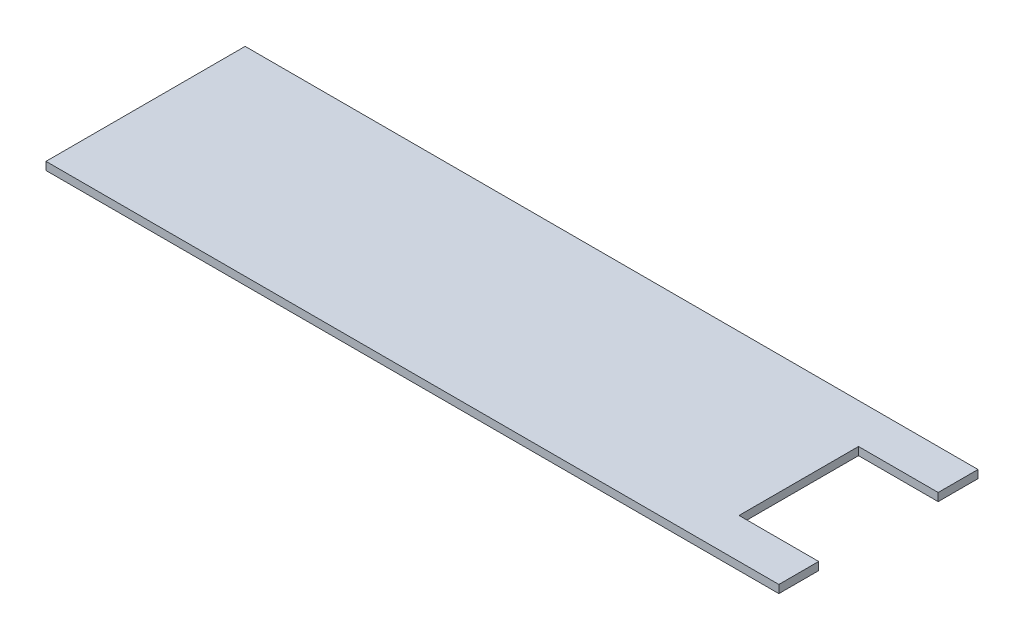
ISO-10303-21;
HEADER;
FILE_DESCRIPTION(('STEP AP214'),'2;1');
FILE_NAME('part.step','',(''),(''),'','','');
FILE_SCHEMA(('AUTOMOTIVE_DESIGN { 1 0 10303 214 1 1 1 1 }'));
ENDSEC;
DATA;
#1=APPLICATION_CONTEXT('core data for automotive mechanical design processes');
#2=APPLICATION_PROTOCOL_DEFINITION('international standard','automotive_design',2000,#1);
#3=PRODUCT_CONTEXT('',#1,'mechanical');
#4=PRODUCT('Part','Part','',(#3));
#5=PRODUCT_RELATED_PRODUCT_CATEGORY('part','',(#4));
#6=PRODUCT_DEFINITION_FORMATION('','',#4);
#7=PRODUCT_DEFINITION_CONTEXT('part definition',#1,'design');
#8=PRODUCT_DEFINITION('design','',#6,#7);
#9=PRODUCT_DEFINITION_SHAPE('','',#8);
#10=(LENGTH_UNIT() NAMED_UNIT(*) SI_UNIT(.MILLI.,.METRE.));
#11=(NAMED_UNIT(*) PLANE_ANGLE_UNIT() SI_UNIT($,.RADIAN.));
#12=(NAMED_UNIT(*) SI_UNIT($,.STERADIAN.) SOLID_ANGLE_UNIT());
#13=UNCERTAINTY_MEASURE_WITH_UNIT(LENGTH_MEASURE(1.E-05),#10,'distance_accuracy_value','');
#14=(GEOMETRIC_REPRESENTATION_CONTEXT(3) GLOBAL_UNCERTAINTY_ASSIGNED_CONTEXT((#13)) GLOBAL_UNIT_ASSIGNED_CONTEXT((#10,
#11,#12)) REPRESENTATION_CONTEXT('',''));
#15=CARTESIAN_POINT('',(0.,0.,0.));
#16=DIRECTION('',(0.,0.,1.));
#17=DIRECTION('',(1.,0.,0.));
#18=AXIS2_PLACEMENT_3D('',#15,#16,#17);
#19=CARTESIAN_POINT('',(37.5961538461538,1.,-14.1346153846153));
#20=DIRECTION('',(-1.,0.,0.));
#21=DIRECTION('',(0.,0.,1.));
#22=AXIS2_PLACEMENT_3D('',#19,#20,#21);
#23=PLANE('',#22);
#24=DIRECTION('',(0.,0.,-1.));
#25=VECTOR('',#24,1.);
#26=CARTESIAN_POINT('',(37.5961538461538,1.,-14.1346153846153));
#27=LINE('',#26,#25);
#28=CARTESIAN_POINT('',(37.5961538461538,1.,-9.13461538461535));
#29=VERTEX_POINT('',#28);
#30=CARTESIAN_POINT('',(37.5961538461538,1.,-14.1346153846153));
#31=VERTEX_POINT('',#30);
#32=EDGE_CURVE('E165',#29,#31,#27,.T.);
#33=ORIENTED_EDGE('',*,*,#32,.F.);
#34=DIRECTION('',(0.,1.,0.));
#35=VECTOR('',#34,1.);
#36=CARTESIAN_POINT('',(37.5961538461538,0.,-9.13461538461535));
#37=LINE('',#36,#35);
#38=CARTESIAN_POINT('',(37.5961538461538,0.,-9.13461538461535));
#39=VERTEX_POINT('',#38);
#40=EDGE_CURVE('E155',#39,#29,#37,.T.);
#41=ORIENTED_EDGE('',*,*,#40,.F.);
#42=DIRECTION('',(0.,0.,-1.));
#43=VECTOR('',#42,1.);
#44=CARTESIAN_POINT('',(37.5961538461538,0.,-14.1346153846153));
#45=LINE('',#44,#43);
#46=CARTESIAN_POINT('',(37.5961538461538,0.,-14.1346153846153));
#47=VERTEX_POINT('',#46);
#48=EDGE_CURVE('E179',#39,#47,#45,.T.);
#49=ORIENTED_EDGE('',*,*,#48,.T.);
#50=DIRECTION('',(0.,-1.,0.));
#51=VECTOR('',#50,1.);
#52=CARTESIAN_POINT('',(37.5961538461538,1.,-14.1346153846153));
#53=LINE('',#52,#51);
#54=EDGE_CURVE('E187',#31,#47,#53,.T.);
#55=ORIENTED_EDGE('',*,*,#54,.F.);
#56=EDGE_LOOP('',(#33,#41,#49,#55));
#57=FACE_BOUND('',#56,.T.);
#58=ADVANCED_FACE('F41',(#57),#23,.F.);
#59=CARTESIAN_POINT('',(-54.4038461538462,1.,-14.1346153846153));
#60=DIRECTION('',(1.,0.,0.));
#61=DIRECTION('',(0.,0.,-1.));
#62=AXIS2_PLACEMENT_3D('',#59,#60,#61);
#63=PLANE('',#62);
#64=DIRECTION('',(0.,0.,1.));
#65=VECTOR('',#64,1.);
#66=CARTESIAN_POINT('',(-54.4038461538462,0.,-14.1346153846153));
#67=LINE('',#66,#65);
#68=CARTESIAN_POINT('',(-54.4038461538462,0.,-14.1346153846153));
#69=VERTEX_POINT('',#68);
#70=CARTESIAN_POINT('',(-54.4038461538462,0.,10.8653846153847));
#71=VERTEX_POINT('',#70);
#72=EDGE_CURVE('E154',#69,#71,#67,.T.);
#73=ORIENTED_EDGE('',*,*,#72,.T.);
#74=DIRECTION('',(0.,-1.,0.));
#75=VECTOR('',#74,1.);
#76=CARTESIAN_POINT('',(-54.4038461538462,1.,10.8653846153847));
#77=LINE('',#76,#75);
#78=CARTESIAN_POINT('',(-54.4038461538462,1.,10.8653846153847));
#79=VERTEX_POINT('',#78);
#80=EDGE_CURVE('E11',#79,#71,#77,.T.);
#81=ORIENTED_EDGE('',*,*,#80,.F.);
#82=DIRECTION('',(0.,0.,1.));
#83=VECTOR('',#82,1.);
#84=CARTESIAN_POINT('',(-54.4038461538462,1.,-14.1346153846153));
#85=LINE('',#84,#83);
#86=CARTESIAN_POINT('',(-54.4038461538462,1.,-14.1346153846153));
#87=VERTEX_POINT('',#86);
#88=EDGE_CURVE('E160',#87,#79,#85,.T.);
#89=ORIENTED_EDGE('',*,*,#88,.F.);
#90=DIRECTION('',(0.,-1.,0.));
#91=VECTOR('',#90,1.);
#92=CARTESIAN_POINT('',(-54.4038461538462,1.,-14.1346153846153));
#93=LINE('',#92,#91);
#94=EDGE_CURVE('E172',#87,#69,#93,.T.);
#95=ORIENTED_EDGE('',*,*,#94,.T.);
#96=EDGE_LOOP('',(#73,#81,#89,#95));
#97=FACE_BOUND('',#96,.T.);
#98=ADVANCED_FACE('F43',(#97),#63,.F.);
#99=CARTESIAN_POINT('',(-54.4038461538462,1.,10.8653846153847));
#100=DIRECTION('',(0.,0.,-1.));
#101=DIRECTION('',(-1.,0.,0.));
#102=AXIS2_PLACEMENT_3D('',#99,#100,#101);
#103=PLANE('',#102);
#104=DIRECTION('',(1.,0.,0.));
#105=VECTOR('',#104,1.);
#106=CARTESIAN_POINT('',(-54.4038461538462,0.,10.8653846153847));
#107=LINE('',#106,#105);
#108=CARTESIAN_POINT('',(37.5961538461538,0.,10.8653846153847));
#109=VERTEX_POINT('',#108);
#110=EDGE_CURVE('E176',#71,#109,#107,.T.);
#111=ORIENTED_EDGE('',*,*,#110,.T.);
#112=DIRECTION('',(0.,-1.,0.));
#113=VECTOR('',#112,1.);
#114=CARTESIAN_POINT('',(37.5961538461538,1.,10.8653846153847));
#115=LINE('',#114,#113);
#116=CARTESIAN_POINT('',(37.5961538461538,1.,10.8653846153847));
#117=VERTEX_POINT('',#116);
#118=EDGE_CURVE('E50',#117,#109,#115,.T.);
#119=ORIENTED_EDGE('',*,*,#118,.F.);
#120=DIRECTION('',(1.,0.,0.));
#121=VECTOR('',#120,1.);
#122=CARTESIAN_POINT('',(-54.4038461538462,1.,10.8653846153847));
#123=LINE('',#122,#121);
#124=EDGE_CURVE('E94',#79,#117,#123,.T.);
#125=ORIENTED_EDGE('',*,*,#124,.F.);
#126=ORIENTED_EDGE('',*,*,#80,.T.);
#127=EDGE_LOOP('',(#111,#119,#125,#126));
#128=FACE_BOUND('',#127,.T.);
#129=ADVANCED_FACE('F196',(#128),#103,.F.);
#130=CARTESIAN_POINT('',(37.5961538461538,0.,5.86538461538465));
#131=VERTEX_POINT('',#130);
#132=EDGE_CURVE('E180',#109,#131,#45,.T.);
#133=ORIENTED_EDGE('',*,*,#132,.T.);
#134=DIRECTION('',(0.,1.,0.));
#135=VECTOR('',#134,1.);
#136=CARTESIAN_POINT('',(37.5961538461538,0.,5.86538461538465));
#137=LINE('',#136,#135);
#138=CARTESIAN_POINT('',(37.5961538461538,1.,5.86538461538465));
#139=VERTEX_POINT('',#138);
#140=EDGE_CURVE('E57',#131,#139,#137,.T.);
#141=ORIENTED_EDGE('',*,*,#140,.T.);
#142=EDGE_CURVE('E166',#117,#139,#27,.T.);
#143=ORIENTED_EDGE('',*,*,#142,.F.);
#144=ORIENTED_EDGE('',*,*,#118,.T.);
#145=EDGE_LOOP('',(#133,#141,#143,#144));
#146=FACE_BOUND('',#145,.T.);
#147=ADVANCED_FACE('F193',(#146),#23,.F.);
#148=CARTESIAN_POINT('',(-54.4038461538462,1.,-14.1346153846153));
#149=DIRECTION('',(0.,0.,1.));
#150=DIRECTION('',(1.,0.,0.));
#151=AXIS2_PLACEMENT_3D('',#148,#149,#150);
#152=PLANE('',#151);
#153=DIRECTION('',(-1.,0.,0.));
#154=VECTOR('',#153,1.);
#155=CARTESIAN_POINT('',(-54.4038461538462,0.,-14.1346153846153));
#156=LINE('',#155,#154);
#157=EDGE_CURVE('E87',#47,#69,#156,.T.);
#158=ORIENTED_EDGE('',*,*,#157,.T.);
#159=ORIENTED_EDGE('',*,*,#94,.F.);
#160=DIRECTION('',(-1.,0.,0.));
#161=VECTOR('',#160,1.);
#162=CARTESIAN_POINT('',(-54.4038461538462,1.,-14.1346153846153));
#163=LINE('',#162,#161);
#164=EDGE_CURVE('E66',#31,#87,#163,.T.);
#165=ORIENTED_EDGE('',*,*,#164,.F.);
#166=ORIENTED_EDGE('',*,*,#54,.T.);
#167=EDGE_LOOP('',(#158,#159,#165,#166));
#168=FACE_BOUND('',#167,.T.);
#169=ADVANCED_FACE('F199',(#168),#152,.F.);
#170=CARTESIAN_POINT('',(0.,1.,0.));
#171=DIRECTION('',(0.,1.,0.));
#172=DIRECTION('',(0.,0.,1.));
#173=AXIS2_PLACEMENT_3D('',#170,#171,#172);
#174=PLANE('',#173);
#175=DIRECTION('',(-1.,0.,0.));
#176=VECTOR('',#175,1.);
#177=CARTESIAN_POINT('',(27.5961538461538,1.,-9.13461538461535));
#178=LINE('',#177,#176);
#179=CARTESIAN_POINT('',(27.5961538461538,1.,-9.13461538461535));
#180=VERTEX_POINT('',#179);
#181=EDGE_CURVE('E138',#29,#180,#178,.T.);
#182=ORIENTED_EDGE('',*,*,#181,.F.);
#183=ORIENTED_EDGE('',*,*,#32,.T.);
#184=ORIENTED_EDGE('',*,*,#164,.T.);
#185=ORIENTED_EDGE('',*,*,#88,.T.);
#186=ORIENTED_EDGE('',*,*,#124,.T.);
#187=ORIENTED_EDGE('',*,*,#142,.T.);
#188=DIRECTION('',(1.,0.,0.));
#189=VECTOR('',#188,1.);
#190=CARTESIAN_POINT('',(27.5961538461538,1.,5.86538461538465));
#191=LINE('',#190,#189);
#192=CARTESIAN_POINT('',(27.5961538461538,1.,5.86538461538465));
#193=VERTEX_POINT('',#192);
#194=EDGE_CURVE('E142',#193,#139,#191,.T.);
#195=ORIENTED_EDGE('',*,*,#194,.F.);
#196=DIRECTION('',(0.,0.,1.));
#197=VECTOR('',#196,1.);
#198=CARTESIAN_POINT('',(27.5961538461538,1.,-9.13461538461535));
#199=LINE('',#198,#197);
#200=EDGE_CURVE('E123',#180,#193,#199,.T.);
#201=ORIENTED_EDGE('',*,*,#200,.F.);
#202=EDGE_LOOP('',(#182,#183,#184,#185,#186,#187,#195,#201));
#203=FACE_BOUND('',#202,.T.);
#204=ADVANCED_FACE('F207',(#203),#174,.T.);
#205=CARTESIAN_POINT('',(0.,0.,0.));
#206=DIRECTION('',(0.,1.,0.));
#207=DIRECTION('',(0.,0.,1.));
#208=AXIS2_PLACEMENT_3D('',#205,#206,#207);
#209=PLANE('',#208);
#210=ORIENTED_EDGE('',*,*,#48,.F.);
#211=DIRECTION('',(-1.,0.,0.));
#212=VECTOR('',#211,1.);
#213=CARTESIAN_POINT('',(27.5961538461538,0.,-9.13461538461535));
#214=LINE('',#213,#212);
#215=CARTESIAN_POINT('',(27.5961538461538,0.,-9.13461538461535));
#216=VERTEX_POINT('',#215);
#217=EDGE_CURVE('E126',#39,#216,#214,.T.);
#218=ORIENTED_EDGE('',*,*,#217,.T.);
#219=DIRECTION('',(0.,0.,1.));
#220=VECTOR('',#219,1.);
#221=CARTESIAN_POINT('',(27.5961538461538,0.,-9.13461538461535));
#222=LINE('',#221,#220);
#223=CARTESIAN_POINT('',(27.5961538461538,0.,5.86538461538465));
#224=VERTEX_POINT('',#223);
#225=EDGE_CURVE('E120',#216,#224,#222,.T.);
#226=ORIENTED_EDGE('',*,*,#225,.T.);
#227=DIRECTION('',(1.,0.,0.));
#228=VECTOR('',#227,1.);
#229=CARTESIAN_POINT('',(27.5961538461538,0.,5.86538461538465));
#230=LINE('',#229,#228);
#231=EDGE_CURVE('E128',#224,#131,#230,.T.);
#232=ORIENTED_EDGE('',*,*,#231,.T.);
#233=ORIENTED_EDGE('',*,*,#132,.F.);
#234=ORIENTED_EDGE('',*,*,#110,.F.);
#235=ORIENTED_EDGE('',*,*,#72,.F.);
#236=ORIENTED_EDGE('',*,*,#157,.F.);
#237=EDGE_LOOP('',(#210,#218,#226,#232,#233,#234,#235,#236));
#238=FACE_BOUND('',#237,.T.);
#239=ADVANCED_FACE('F136',(#238),#209,.F.);
#240=CARTESIAN_POINT('',(27.5961538461538,0.,-9.13461538461535));
#241=DIRECTION('',(-1.,0.,0.));
#242=DIRECTION('',(0.,0.,1.));
#243=AXIS2_PLACEMENT_3D('',#240,#241,#242);
#244=PLANE('',#243);
#245=ORIENTED_EDGE('',*,*,#200,.T.);
#246=DIRECTION('',(0.,1.,0.));
#247=VECTOR('',#246,1.);
#248=CARTESIAN_POINT('',(27.5961538461538,0.,5.86538461538465));
#249=LINE('',#248,#247);
#250=EDGE_CURVE('E117',#224,#193,#249,.T.);
#251=ORIENTED_EDGE('',*,*,#250,.F.);
#252=ORIENTED_EDGE('',*,*,#225,.F.);
#253=DIRECTION('',(0.,1.,0.));
#254=VECTOR('',#253,1.);
#255=CARTESIAN_POINT('',(27.5961538461538,0.,-9.13461538461535));
#256=LINE('',#255,#254);
#257=EDGE_CURVE('E151',#216,#180,#256,.T.);
#258=ORIENTED_EDGE('',*,*,#257,.T.);
#259=EDGE_LOOP('',(#245,#251,#252,#258));
#260=FACE_BOUND('',#259,.T.);
#261=ADVANCED_FACE('F118',(#260),#244,.F.);
#262=CARTESIAN_POINT('',(27.5961538461538,0.,-9.13461538461535));
#263=DIRECTION('',(0.,0.,-1.));
#264=DIRECTION('',(-1.,0.,0.));
#265=AXIS2_PLACEMENT_3D('',#262,#263,#264);
#266=PLANE('',#265);
#267=ORIENTED_EDGE('',*,*,#181,.T.);
#268=ORIENTED_EDGE('',*,*,#257,.F.);
#269=ORIENTED_EDGE('',*,*,#217,.F.);
#270=ORIENTED_EDGE('',*,*,#40,.T.);
#271=EDGE_LOOP('',(#267,#268,#269,#270));
#272=FACE_BOUND('',#271,.T.);
#273=ADVANCED_FACE('F209',(#272),#266,.F.);
#274=CARTESIAN_POINT('',(27.5961538461538,0.,5.86538461538465));
#275=DIRECTION('',(0.,0.,1.));
#276=DIRECTION('',(1.,0.,0.));
#277=AXIS2_PLACEMENT_3D('',#274,#275,#276);
#278=PLANE('',#277);
#279=ORIENTED_EDGE('',*,*,#194,.T.);
#280=ORIENTED_EDGE('',*,*,#140,.F.);
#281=ORIENTED_EDGE('',*,*,#231,.F.);
#282=ORIENTED_EDGE('',*,*,#250,.T.);
#283=EDGE_LOOP('',(#279,#280,#281,#282));
#284=FACE_BOUND('',#283,.T.);
#285=ADVANCED_FACE('F129',(#284),#278,.F.);
#286=CLOSED_SHELL('',(#58,#98,#129,#147,#169,#204,#239,#261,#273,#285));
#287=MANIFOLD_SOLID_BREP('B2',#286);
#288=ADVANCED_BREP_SHAPE_REPRESENTATION('',(#18,#287),#14);
#289=SHAPE_DEFINITION_REPRESENTATION(#9,#288);
ENDSEC;
END-ISO-10303-21;
